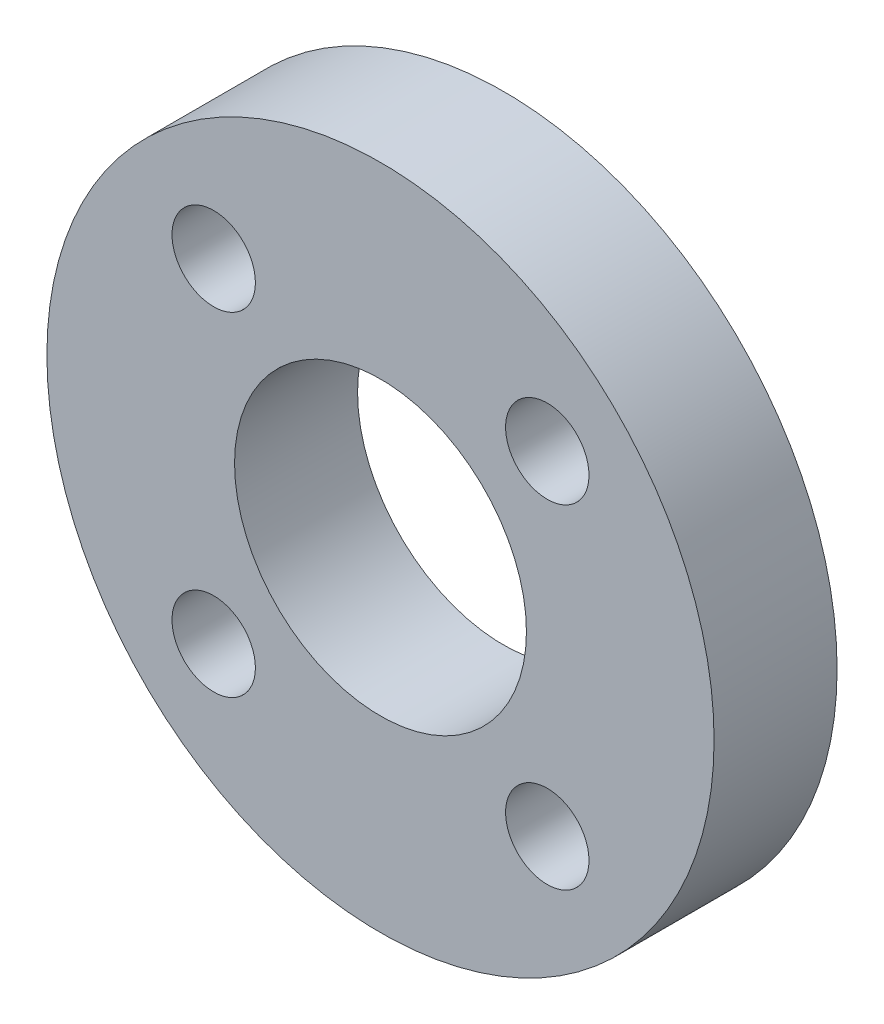
ISO-10303-21;
HEADER;
FILE_DESCRIPTION(('STEP AP214'),'2;1');
FILE_NAME('part.step','',(''),(''),'','','');
FILE_SCHEMA(('AUTOMOTIVE_DESIGN { 1 0 10303 214 1 1 1 1 }'));
ENDSEC;
DATA;
#1=APPLICATION_CONTEXT('core data for automotive mechanical design processes');
#2=APPLICATION_PROTOCOL_DEFINITION('international standard','automotive_design',2000,#1);
#3=PRODUCT_CONTEXT('',#1,'mechanical');
#4=PRODUCT('Part','Part','',(#3));
#5=PRODUCT_RELATED_PRODUCT_CATEGORY('part','',(#4));
#6=PRODUCT_DEFINITION_FORMATION('','',#4);
#7=PRODUCT_DEFINITION_CONTEXT('part definition',#1,'design');
#8=PRODUCT_DEFINITION('design','',#6,#7);
#9=PRODUCT_DEFINITION_SHAPE('','',#8);
#10=(LENGTH_UNIT() NAMED_UNIT(*) SI_UNIT(.MILLI.,.METRE.));
#11=(NAMED_UNIT(*) PLANE_ANGLE_UNIT() SI_UNIT($,.RADIAN.));
#12=(NAMED_UNIT(*) SI_UNIT($,.STERADIAN.) SOLID_ANGLE_UNIT());
#13=UNCERTAINTY_MEASURE_WITH_UNIT(LENGTH_MEASURE(1.E-05),#10,'distance_accuracy_value','');
#14=(GEOMETRIC_REPRESENTATION_CONTEXT(3) GLOBAL_UNCERTAINTY_ASSIGNED_CONTEXT((#13)) GLOBAL_UNIT_ASSIGNED_CONTEXT((#10,
#11,#12)) REPRESENTATION_CONTEXT('',''));
#15=CARTESIAN_POINT('',(0.,0.,0.));
#16=DIRECTION('',(0.,0.,1.));
#17=DIRECTION('',(1.,0.,0.));
#18=AXIS2_PLACEMENT_3D('',#15,#16,#17);
#19=CARTESIAN_POINT('',(0.,0.,5.9));
#20=DIRECTION('',(0.,0.,1.));
#21=DIRECTION('',(1.,0.,0.));
#22=AXIS2_PLACEMENT_3D('',#19,#20,#21);
#23=PLANE('',#22);
#24=CARTESIAN_POINT('',(8.,-8.,5.9));
#25=DIRECTION('',(0.,0.,1.));
#26=DIRECTION('',(1.,0.,0.));
#27=AXIS2_PLACEMENT_3D('',#24,#25,#26);
#28=CIRCLE('',#27,2.);
#29=CARTESIAN_POINT('',(10.,-8.,5.9));
#30=VERTEX_POINT('',#29);
#31=EDGE_CURVE('E74',#30,#30,#28,.T.);
#32=ORIENTED_EDGE('',*,*,#31,.F.);
#33=EDGE_LOOP('',(#32));
#34=FACE_BOUND('',#33,.T.);
#35=CARTESIAN_POINT('',(-8.,8.,5.9));
#36=DIRECTION('',(0.,0.,1.));
#37=DIRECTION('',(1.,0.,0.));
#38=AXIS2_PLACEMENT_3D('',#35,#36,#37);
#39=CIRCLE('',#38,2.);
#40=CARTESIAN_POINT('',(-6.,8.,5.9));
#41=VERTEX_POINT('',#40);
#42=EDGE_CURVE('E58',#41,#41,#39,.T.);
#43=ORIENTED_EDGE('',*,*,#42,.F.);
#44=EDGE_LOOP('',(#43));
#45=FACE_BOUND('',#44,.T.);
#46=CARTESIAN_POINT('',(0.,0.,5.9));
#47=DIRECTION('',(0.,0.,1.));
#48=DIRECTION('',(1.,0.,0.));
#49=AXIS2_PLACEMENT_3D('',#46,#47,#48);
#50=CIRCLE('',#49,16.);
#51=CARTESIAN_POINT('',(16.,0.,5.9));
#52=VERTEX_POINT('',#51);
#53=EDGE_CURVE('E10',#52,#52,#50,.T.);
#54=ORIENTED_EDGE('',*,*,#53,.T.);
#55=EDGE_LOOP('',(#54));
#56=FACE_BOUND('',#55,.T.);
#57=CARTESIAN_POINT('',(0.,0.,5.9));
#58=DIRECTION('',(0.,0.,1.));
#59=DIRECTION('',(1.,0.,0.));
#60=AXIS2_PLACEMENT_3D('',#57,#58,#59);
#61=CIRCLE('',#60,7.);
#62=CARTESIAN_POINT('',(7.,0.,5.9));
#63=VERTEX_POINT('',#62);
#64=EDGE_CURVE('E52',#63,#63,#61,.T.);
#65=ORIENTED_EDGE('',*,*,#64,.F.);
#66=EDGE_LOOP('',(#65));
#67=FACE_BOUND('',#66,.T.);
#68=CARTESIAN_POINT('',(8.,8.,5.9));
#69=DIRECTION('',(0.,0.,1.));
#70=DIRECTION('',(1.,0.,0.));
#71=AXIS2_PLACEMENT_3D('',#68,#69,#70);
#72=CIRCLE('',#71,2.);
#73=CARTESIAN_POINT('',(10.,8.,5.9));
#74=VERTEX_POINT('',#73);
#75=EDGE_CURVE('E66',#74,#74,#72,.T.);
#76=ORIENTED_EDGE('',*,*,#75,.F.);
#77=EDGE_LOOP('',(#76));
#78=FACE_BOUND('',#77,.T.);
#79=CARTESIAN_POINT('',(-7.99999999999999,-8.,5.9));
#80=DIRECTION('',(0.,0.,1.));
#81=DIRECTION('',(1.,0.,0.));
#82=AXIS2_PLACEMENT_3D('',#79,#80,#81);
#83=CIRCLE('',#82,2.);
#84=CARTESIAN_POINT('',(-5.99999999999999,-8.,5.9));
#85=VERTEX_POINT('',#84);
#86=EDGE_CURVE('E82',#85,#85,#83,.T.);
#87=ORIENTED_EDGE('',*,*,#86,.F.);
#88=EDGE_LOOP('',(#87));
#89=FACE_BOUND('',#88,.T.);
#90=ADVANCED_FACE('F39',(#34,#45,#56,#67,#78,#89),#23,.T.);
#91=CARTESIAN_POINT('',(0.,0.,0.));
#92=DIRECTION('',(0.,0.,1.));
#93=DIRECTION('',(1.,0.,0.));
#94=AXIS2_PLACEMENT_3D('',#91,#92,#93);
#95=PLANE('',#94);
#96=CARTESIAN_POINT('',(0.,0.,0.));
#97=DIRECTION('',(0.,0.,1.));
#98=DIRECTION('',(1.,0.,0.));
#99=AXIS2_PLACEMENT_3D('',#96,#97,#98);
#100=CIRCLE('',#99,16.);
#101=CARTESIAN_POINT('',(16.,0.,0.));
#102=VERTEX_POINT('',#101);
#103=EDGE_CURVE('E43',#102,#102,#100,.T.);
#104=ORIENTED_EDGE('',*,*,#103,.F.);
#105=EDGE_LOOP('',(#104));
#106=FACE_BOUND('',#105,.T.);
#107=CARTESIAN_POINT('',(0.,0.,0.));
#108=DIRECTION('',(0.,0.,1.));
#109=DIRECTION('',(1.,0.,0.));
#110=AXIS2_PLACEMENT_3D('',#107,#108,#109);
#111=CIRCLE('',#110,7.);
#112=CARTESIAN_POINT('',(7.,0.,0.));
#113=VERTEX_POINT('',#112);
#114=EDGE_CURVE('E54',#113,#113,#111,.T.);
#115=ORIENTED_EDGE('',*,*,#114,.T.);
#116=EDGE_LOOP('',(#115));
#117=FACE_BOUND('',#116,.T.);
#118=CARTESIAN_POINT('',(-8.,8.,0.));
#119=DIRECTION('',(0.,0.,1.));
#120=DIRECTION('',(1.,0.,0.));
#121=AXIS2_PLACEMENT_3D('',#118,#119,#120);
#122=CIRCLE('',#121,2.);
#123=CARTESIAN_POINT('',(-6.,8.,0.));
#124=VERTEX_POINT('',#123);
#125=EDGE_CURVE('E62',#124,#124,#122,.T.);
#126=ORIENTED_EDGE('',*,*,#125,.T.);
#127=EDGE_LOOP('',(#126));
#128=FACE_BOUND('',#127,.T.);
#129=CARTESIAN_POINT('',(8.,8.,0.));
#130=DIRECTION('',(0.,0.,1.));
#131=DIRECTION('',(1.,0.,0.));
#132=AXIS2_PLACEMENT_3D('',#129,#130,#131);
#133=CIRCLE('',#132,2.);
#134=CARTESIAN_POINT('',(10.,8.,0.));
#135=VERTEX_POINT('',#134);
#136=EDGE_CURVE('E70',#135,#135,#133,.T.);
#137=ORIENTED_EDGE('',*,*,#136,.T.);
#138=EDGE_LOOP('',(#137));
#139=FACE_BOUND('',#138,.T.);
#140=CARTESIAN_POINT('',(8.,-8.,0.));
#141=DIRECTION('',(0.,0.,1.));
#142=DIRECTION('',(1.,0.,0.));
#143=AXIS2_PLACEMENT_3D('',#140,#141,#142);
#144=CIRCLE('',#143,2.);
#145=CARTESIAN_POINT('',(10.,-8.,0.));
#146=VERTEX_POINT('',#145);
#147=EDGE_CURVE('E78',#146,#146,#144,.T.);
#148=ORIENTED_EDGE('',*,*,#147,.T.);
#149=EDGE_LOOP('',(#148));
#150=FACE_BOUND('',#149,.T.);
#151=CARTESIAN_POINT('',(-7.99999999999999,-8.,0.));
#152=DIRECTION('',(0.,0.,1.));
#153=DIRECTION('',(1.,0.,0.));
#154=AXIS2_PLACEMENT_3D('',#151,#152,#153);
#155=CIRCLE('',#154,2.);
#156=CARTESIAN_POINT('',(-5.99999999999999,-8.,0.));
#157=VERTEX_POINT('',#156);
#158=EDGE_CURVE('E86',#157,#157,#155,.T.);
#159=ORIENTED_EDGE('',*,*,#158,.T.);
#160=EDGE_LOOP('',(#159));
#161=FACE_BOUND('',#160,.T.);
#162=ADVANCED_FACE('F98',(#106,#117,#128,#139,#150,#161),#95,.F.);
#163=CARTESIAN_POINT('',(0.,0.,5.9));
#164=DIRECTION('',(0.,0.,-1.));
#165=DIRECTION('',(-1.,0.,0.));
#166=AXIS2_PLACEMENT_3D('',#163,#164,#165);
#167=CYLINDRICAL_SURFACE('',#166,16.);
#168=ORIENTED_EDGE('',*,*,#53,.F.);
#169=EDGE_LOOP('',(#168));
#170=FACE_BOUND('',#169,.T.);
#171=ORIENTED_EDGE('',*,*,#103,.T.);
#172=EDGE_LOOP('',(#171));
#173=FACE_BOUND('',#172,.T.);
#174=ADVANCED_FACE('F41',(#170,#173),#167,.T.);
#175=CARTESIAN_POINT('',(0.,0.,5.9));
#176=DIRECTION('',(0.,0.,-1.));
#177=DIRECTION('',(-1.,0.,0.));
#178=AXIS2_PLACEMENT_3D('',#175,#176,#177);
#179=CYLINDRICAL_SURFACE('',#178,7.);
#180=ORIENTED_EDGE('',*,*,#64,.T.);
#181=EDGE_LOOP('',(#180));
#182=FACE_BOUND('',#181,.T.);
#183=ORIENTED_EDGE('',*,*,#114,.F.);
#184=EDGE_LOOP('',(#183));
#185=FACE_BOUND('',#184,.T.);
#186=ADVANCED_FACE('F108',(#182,#185),#179,.F.);
#187=CARTESIAN_POINT('',(-8.,8.,5.9));
#188=DIRECTION('',(0.,0.,-1.));
#189=DIRECTION('',(-1.,0.,0.));
#190=AXIS2_PLACEMENT_3D('',#187,#188,#189);
#191=CYLINDRICAL_SURFACE('',#190,2.);
#192=ORIENTED_EDGE('',*,*,#42,.T.);
#193=EDGE_LOOP('',(#192));
#194=FACE_BOUND('',#193,.T.);
#195=ORIENTED_EDGE('',*,*,#125,.F.);
#196=EDGE_LOOP('',(#195));
#197=FACE_BOUND('',#196,.T.);
#198=ADVANCED_FACE('F111',(#194,#197),#191,.F.);
#199=CARTESIAN_POINT('',(8.,8.,5.9));
#200=DIRECTION('',(0.,0.,-1.));
#201=DIRECTION('',(-1.,0.,0.));
#202=AXIS2_PLACEMENT_3D('',#199,#200,#201);
#203=CYLINDRICAL_SURFACE('',#202,2.);
#204=ORIENTED_EDGE('',*,*,#75,.T.);
#205=EDGE_LOOP('',(#204));
#206=FACE_BOUND('',#205,.T.);
#207=ORIENTED_EDGE('',*,*,#136,.F.);
#208=EDGE_LOOP('',(#207));
#209=FACE_BOUND('',#208,.T.);
#210=ADVANCED_FACE('F115',(#206,#209),#203,.F.);
#211=CARTESIAN_POINT('',(8.,-8.,5.9));
#212=DIRECTION('',(0.,0.,-1.));
#213=DIRECTION('',(-1.,0.,0.));
#214=AXIS2_PLACEMENT_3D('',#211,#212,#213);
#215=CYLINDRICAL_SURFACE('',#214,2.);
#216=ORIENTED_EDGE('',*,*,#31,.T.);
#217=EDGE_LOOP('',(#216));
#218=FACE_BOUND('',#217,.T.);
#219=ORIENTED_EDGE('',*,*,#147,.F.);
#220=EDGE_LOOP('',(#219));
#221=FACE_BOUND('',#220,.T.);
#222=ADVANCED_FACE('F119',(#218,#221),#215,.F.);
#223=CARTESIAN_POINT('',(-7.99999999999999,-8.,5.9));
#224=DIRECTION('',(0.,0.,-1.));
#225=DIRECTION('',(-1.,0.,0.));
#226=AXIS2_PLACEMENT_3D('',#223,#224,#225);
#227=CYLINDRICAL_SURFACE('',#226,2.);
#228=ORIENTED_EDGE('',*,*,#86,.T.);
#229=EDGE_LOOP('',(#228));
#230=FACE_BOUND('',#229,.T.);
#231=ORIENTED_EDGE('',*,*,#158,.F.);
#232=EDGE_LOOP('',(#231));
#233=FACE_BOUND('',#232,.T.);
#234=ADVANCED_FACE('F94',(#230,#233),#227,.F.);
#235=CLOSED_SHELL('',(#90,#162,#174,#186,#198,#210,#222,#234));
#236=MANIFOLD_SOLID_BREP('B2',#235);
#237=ADVANCED_BREP_SHAPE_REPRESENTATION('',(#18,#236),#14);
#238=SHAPE_DEFINITION_REPRESENTATION(#9,#237);
ENDSEC;
END-ISO-10303-21;
